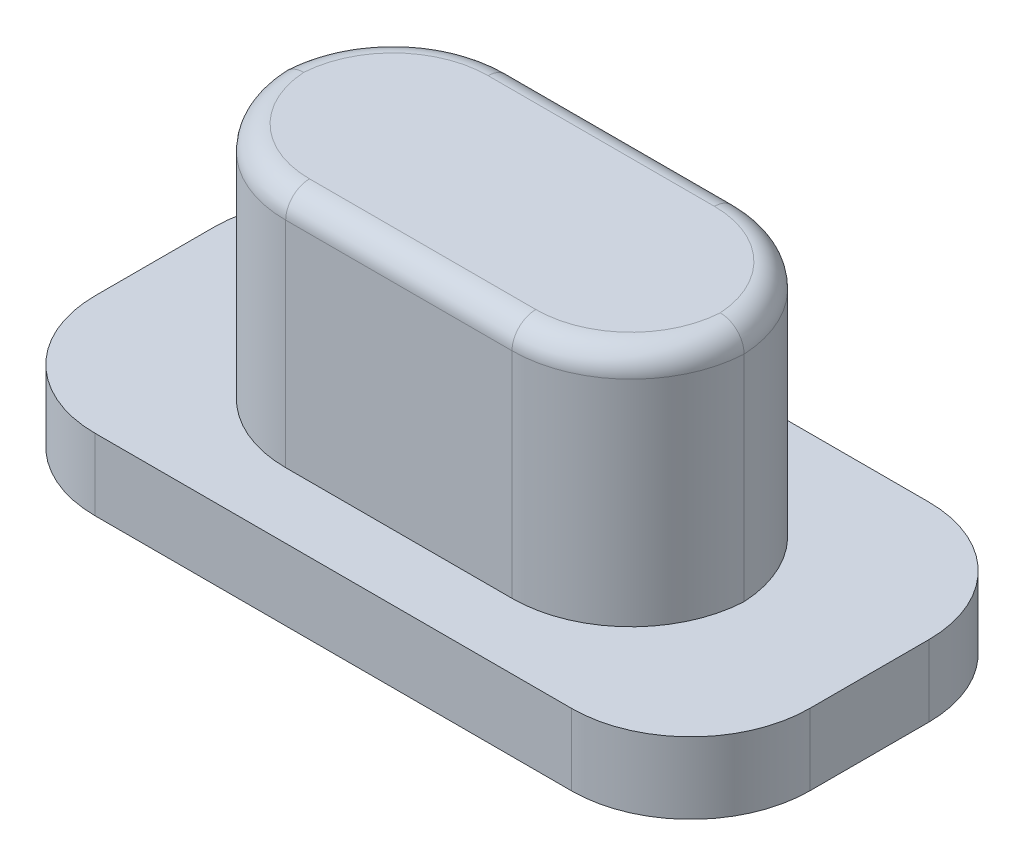
ISO-10303-21;
HEADER;
FILE_DESCRIPTION(('STEP AP214'),'2;1');
FILE_NAME('part.step','',(''),(''),'','','');
FILE_SCHEMA(('AUTOMOTIVE_DESIGN { 1 0 10303 214 1 1 1 1 }'));
ENDSEC;
DATA;
#1=APPLICATION_CONTEXT('core data for automotive mechanical design processes');
#2=APPLICATION_PROTOCOL_DEFINITION('international standard','automotive_design',2000,#1);
#3=PRODUCT_CONTEXT('',#1,'mechanical');
#4=PRODUCT('Part','Part','',(#3));
#5=PRODUCT_RELATED_PRODUCT_CATEGORY('part','',(#4));
#6=PRODUCT_DEFINITION_FORMATION('','',#4);
#7=PRODUCT_DEFINITION_CONTEXT('part definition',#1,'design');
#8=PRODUCT_DEFINITION('design','',#6,#7);
#9=PRODUCT_DEFINITION_SHAPE('','',#8);
#10=(LENGTH_UNIT() NAMED_UNIT(*) SI_UNIT(.MILLI.,.METRE.));
#11=(NAMED_UNIT(*) PLANE_ANGLE_UNIT() SI_UNIT($,.RADIAN.));
#12=(NAMED_UNIT(*) SI_UNIT($,.STERADIAN.) SOLID_ANGLE_UNIT());
#13=UNCERTAINTY_MEASURE_WITH_UNIT(LENGTH_MEASURE(1.E-05),#10,'distance_accuracy_value','');
#14=(GEOMETRIC_REPRESENTATION_CONTEXT(3) GLOBAL_UNCERTAINTY_ASSIGNED_CONTEXT((#13)) GLOBAL_UNIT_ASSIGNED_CONTEXT((#10,
#11,#12)) REPRESENTATION_CONTEXT('',''));
#15=CARTESIAN_POINT('',(0.,0.,0.));
#16=DIRECTION('',(0.,0.,1.));
#17=DIRECTION('',(1.,0.,0.));
#18=AXIS2_PLACEMENT_3D('',#15,#16,#17);
#19=CARTESIAN_POINT('',(0.,0.,0.));
#20=DIRECTION('',(0.,1.,0.));
#21=DIRECTION('',(0.,0.,1.));
#22=AXIS2_PLACEMENT_3D('',#19,#20,#21);
#23=PLANE('',#22);
#24=DIRECTION('',(-1.,0.,0.));
#25=VECTOR('',#24,1.);
#26=CARTESIAN_POINT('',(-2.50310695575245,0.,-1.76035479309902));
#27=LINE('',#26,#25);
#28=CARTESIAN_POINT('',(2.49689304424755,0.,-1.76035479309902));
#29=VERTEX_POINT('',#28);
#30=CARTESIAN_POINT('',(-1.50310695575245,0.,-1.76035479309902));
#31=VERTEX_POINT('',#30);
#32=EDGE_CURVE('E225',#29,#31,#27,.T.);
#33=ORIENTED_EDGE('',*,*,#32,.F.);
#34=CARTESIAN_POINT('',(2.49689304424755,0.,-0.760354793099017));
#35=DIRECTION('',(0.,1.,0.));
#36=DIRECTION('',(0.,0.,1.));
#37=AXIS2_PLACEMENT_3D('',#34,#35,#36);
#38=CIRCLE('',#37,1.);
#39=CARTESIAN_POINT('',(3.49689304424755,0.,-0.760354793099017));
#40=VERTEX_POINT('',#39);
#41=EDGE_CURVE('E255',#29,#40,#38,.F.);
#42=ORIENTED_EDGE('',*,*,#41,.T.);
#43=DIRECTION('',(0.,0.,-1.));
#44=VECTOR('',#43,1.);
#45=CARTESIAN_POINT('',(3.49689304424755,0.,-1.76035479309902));
#46=LINE('',#45,#44);
#47=CARTESIAN_POINT('',(3.49689304424755,0.,0.239645206900983));
#48=VERTEX_POINT('',#47);
#49=EDGE_CURVE('E240',#48,#40,#46,.T.);
#50=ORIENTED_EDGE('',*,*,#49,.F.);
#51=CARTESIAN_POINT('',(2.49689304424755,0.,0.239645206900984));
#52=DIRECTION('',(0.,1.,0.));
#53=DIRECTION('',(0.,0.,1.));
#54=AXIS2_PLACEMENT_3D('',#51,#52,#53);
#55=CIRCLE('',#54,1.);
#56=CARTESIAN_POINT('',(2.49689304424755,0.,1.23964520690098));
#57=VERTEX_POINT('',#56);
#58=EDGE_CURVE('E253',#48,#57,#55,.F.);
#59=ORIENTED_EDGE('',*,*,#58,.T.);
#60=DIRECTION('',(1.,0.,0.));
#61=VECTOR('',#60,1.);
#62=CARTESIAN_POINT('',(-2.50310695575245,0.,1.23964520690098));
#63=LINE('',#62,#61);
#64=CARTESIAN_POINT('',(-1.50310695575245,0.,1.23964520690098));
#65=VERTEX_POINT('',#64);
#66=EDGE_CURVE('E237',#65,#57,#63,.T.);
#67=ORIENTED_EDGE('',*,*,#66,.F.);
#68=CARTESIAN_POINT('',(-1.50310695575245,0.,0.239645206900983));
#69=DIRECTION('',(0.,1.,0.));
#70=DIRECTION('',(0.,0.,1.));
#71=AXIS2_PLACEMENT_3D('',#68,#69,#70);
#72=CIRCLE('',#71,1.);
#73=CARTESIAN_POINT('',(-2.50310695575245,0.,0.239645206900983));
#74=VERTEX_POINT('',#73);
#75=EDGE_CURVE('E249',#65,#74,#72,.F.);
#76=ORIENTED_EDGE('',*,*,#75,.T.);
#77=DIRECTION('',(0.,0.,1.));
#78=VECTOR('',#77,1.);
#79=CARTESIAN_POINT('',(-2.50310695575245,0.,-1.76035479309902));
#80=LINE('',#79,#78);
#81=CARTESIAN_POINT('',(-2.50310695575245,0.,-0.760354793099017));
#82=VERTEX_POINT('',#81);
#83=EDGE_CURVE('E220',#82,#74,#80,.T.);
#84=ORIENTED_EDGE('',*,*,#83,.F.);
#85=CARTESIAN_POINT('',(-1.50310695575245,0.,-0.760354793099017));
#86=DIRECTION('',(0.,1.,0.));
#87=DIRECTION('',(0.,0.,1.));
#88=AXIS2_PLACEMENT_3D('',#85,#86,#87);
#89=CIRCLE('',#88,1.);
#90=EDGE_CURVE('E251',#82,#31,#89,.F.);
#91=ORIENTED_EDGE('',*,*,#90,.T.);
#92=EDGE_LOOP('',(#33,#42,#50,#59,#67,#76,#84,#91));
#93=FACE_BOUND('',#92,.T.);
#94=DIRECTION('',(0.,0.,-1.));
#95=VECTOR('',#94,1.);
#96=CARTESIAN_POINT('',(-1.00310695575245,0.,-1.06035479309902));
#97=LINE('',#96,#95);
#98=CARTESIAN_POINT('',(-1.00310695575245,0.,0.539645206900984));
#99=VERTEX_POINT('',#98);
#100=CARTESIAN_POINT('',(-1.00310695575245,0.,-1.06035479309902));
#101=VERTEX_POINT('',#100);
#102=EDGE_CURVE('E205',#99,#101,#97,.T.);
#103=ORIENTED_EDGE('',*,*,#102,.F.);
#104=DIRECTION('',(-1.,0.,0.));
#105=VECTOR('',#104,1.);
#106=CARTESIAN_POINT('',(1.99689304424755,0.,0.539645206900984));
#107=LINE('',#106,#105);
#108=CARTESIAN_POINT('',(1.99689304424755,0.,0.539645206900984));
#109=VERTEX_POINT('',#108);
#110=EDGE_CURVE('E202',#109,#99,#107,.T.);
#111=ORIENTED_EDGE('',*,*,#110,.F.);
#112=DIRECTION('',(0.,0.,1.));
#113=VECTOR('',#112,1.);
#114=CARTESIAN_POINT('',(1.99689304424755,0.,-1.06035479309902));
#115=LINE('',#114,#113);
#116=CARTESIAN_POINT('',(1.99689304424755,0.,-1.06035479309902));
#117=VERTEX_POINT('',#116);
#118=EDGE_CURVE('E654',#117,#109,#115,.T.);
#119=ORIENTED_EDGE('',*,*,#118,.F.);
#120=DIRECTION('',(1.,0.,0.));
#121=VECTOR('',#120,1.);
#122=CARTESIAN_POINT('',(1.99689304424755,0.,-1.06035479309902));
#123=LINE('',#122,#121);
#124=EDGE_CURVE('E660',#101,#117,#123,.T.);
#125=ORIENTED_EDGE('',*,*,#124,.F.);
#126=EDGE_LOOP('',(#103,#111,#119,#125));
#127=FACE_BOUND('',#126,.T.);
#128=ADVANCED_FACE('F35',(#93,#127),#23,.F.);
#129=CARTESIAN_POINT('',(-2.50310695575245,0.6,-1.76035479309902));
#130=DIRECTION('',(1.,0.,0.));
#131=DIRECTION('',(0.,0.,-1.));
#132=AXIS2_PLACEMENT_3D('',#129,#130,#131);
#133=PLANE('',#132);
#134=DIRECTION('',(0.,0.,1.));
#135=VECTOR('',#134,1.);
#136=CARTESIAN_POINT('',(-2.50310695575245,0.6,-1.76035479309902));
#137=LINE('',#136,#135);
#138=CARTESIAN_POINT('',(-2.50310695575245,0.6,-0.760354793099017));
#139=VERTEX_POINT('',#138);
#140=CARTESIAN_POINT('',(-2.50310695575245,0.6,0.239645206900983));
#141=VERTEX_POINT('',#140);
#142=EDGE_CURVE('E221',#139,#141,#137,.T.);
#143=ORIENTED_EDGE('',*,*,#142,.F.);
#144=DIRECTION('',(0.,-1.,0.));
#145=VECTOR('',#144,1.);
#146=CARTESIAN_POINT('',(-2.50310695575245,0.6,-0.760354793099017));
#147=LINE('',#146,#145);
#148=EDGE_CURVE('E277',#139,#82,#147,.T.);
#149=ORIENTED_EDGE('',*,*,#148,.T.);
#150=ORIENTED_EDGE('',*,*,#83,.T.);
#151=DIRECTION('',(0.,-1.,0.));
#152=VECTOR('',#151,1.);
#153=CARTESIAN_POINT('',(-2.50310695575245,0.6,0.239645206900983));
#154=LINE('',#153,#152);
#155=EDGE_CURVE('E275',#74,#141,#154,.F.);
#156=ORIENTED_EDGE('',*,*,#155,.T.);
#157=EDGE_LOOP('',(#143,#149,#150,#156));
#158=FACE_BOUND('',#157,.T.);
#159=ADVANCED_FACE('F414',(#158),#133,.F.);
#160=CARTESIAN_POINT('',(-2.50310695575245,0.6,1.23964520690098));
#161=DIRECTION('',(0.,0.,-1.));
#162=DIRECTION('',(-1.,0.,0.));
#163=AXIS2_PLACEMENT_3D('',#160,#161,#162);
#164=PLANE('',#163);
#165=ORIENTED_EDGE('',*,*,#66,.T.);
#166=DIRECTION('',(0.,-1.,0.));
#167=VECTOR('',#166,1.);
#168=CARTESIAN_POINT('',(2.49689304424755,0.6,1.23964520690098));
#169=LINE('',#168,#167);
#170=CARTESIAN_POINT('',(2.49689304424755,0.6,1.23964520690098));
#171=VERTEX_POINT('',#170);
#172=EDGE_CURVE('E273',#57,#171,#169,.F.);
#173=ORIENTED_EDGE('',*,*,#172,.T.);
#174=DIRECTION('',(1.,0.,0.));
#175=VECTOR('',#174,1.);
#176=CARTESIAN_POINT('',(-2.50310695575245,0.6,1.23964520690098));
#177=LINE('',#176,#175);
#178=CARTESIAN_POINT('',(-1.50310695575245,0.6,1.23964520690098));
#179=VERTEX_POINT('',#178);
#180=EDGE_CURVE('E224',#179,#171,#177,.T.);
#181=ORIENTED_EDGE('',*,*,#180,.F.);
#182=DIRECTION('',(0.,-1.,0.));
#183=VECTOR('',#182,1.);
#184=CARTESIAN_POINT('',(-1.50310695575245,0.6,1.23964520690098));
#185=LINE('',#184,#183);
#186=EDGE_CURVE('E270',#179,#65,#185,.T.);
#187=ORIENTED_EDGE('',*,*,#186,.T.);
#188=EDGE_LOOP('',(#165,#173,#181,#187));
#189=FACE_BOUND('',#188,.T.);
#190=ADVANCED_FACE('F420',(#189),#164,.F.);
#191=CARTESIAN_POINT('',(3.49689304424755,0.6,-1.76035479309902));
#192=DIRECTION('',(-1.,0.,0.));
#193=DIRECTION('',(0.,0.,1.));
#194=AXIS2_PLACEMENT_3D('',#191,#192,#193);
#195=PLANE('',#194);
#196=ORIENTED_EDGE('',*,*,#49,.T.);
#197=DIRECTION('',(0.,-1.,0.));
#198=VECTOR('',#197,1.);
#199=CARTESIAN_POINT('',(3.49689304424755,0.6,-0.760354793099017));
#200=LINE('',#199,#198);
#201=CARTESIAN_POINT('',(3.49689304424755,0.6,-0.760354793099017));
#202=VERTEX_POINT('',#201);
#203=EDGE_CURVE('E260',#40,#202,#200,.F.);
#204=ORIENTED_EDGE('',*,*,#203,.T.);
#205=DIRECTION('',(0.,0.,-1.));
#206=VECTOR('',#205,1.);
#207=CARTESIAN_POINT('',(3.49689304424755,0.6,-1.76035479309902));
#208=LINE('',#207,#206);
#209=CARTESIAN_POINT('',(3.49689304424755,0.6,0.239645206900983));
#210=VERTEX_POINT('',#209);
#211=EDGE_CURVE('E228',#210,#202,#208,.T.);
#212=ORIENTED_EDGE('',*,*,#211,.F.);
#213=DIRECTION('',(0.,-1.,0.));
#214=VECTOR('',#213,1.);
#215=CARTESIAN_POINT('',(3.49689304424755,0.6,0.239645206900983));
#216=LINE('',#215,#214);
#217=EDGE_CURVE('E257',#210,#48,#216,.T.);
#218=ORIENTED_EDGE('',*,*,#217,.T.);
#219=EDGE_LOOP('',(#196,#204,#212,#218));
#220=FACE_BOUND('',#219,.T.);
#221=ADVANCED_FACE('F431',(#220),#195,.F.);
#222=CARTESIAN_POINT('',(-2.50310695575245,0.6,-1.76035479309902));
#223=DIRECTION('',(0.,0.,1.));
#224=DIRECTION('',(1.,0.,0.));
#225=AXIS2_PLACEMENT_3D('',#222,#223,#224);
#226=PLANE('',#225);
#227=DIRECTION('',(-1.,0.,0.));
#228=VECTOR('',#227,1.);
#229=CARTESIAN_POINT('',(-2.50310695575245,0.6,-1.76035479309902));
#230=LINE('',#229,#228);
#231=CARTESIAN_POINT('',(2.49689304424755,0.6,-1.76035479309902));
#232=VERTEX_POINT('',#231);
#233=CARTESIAN_POINT('',(-1.50310695575245,0.6,-1.76035479309902));
#234=VERTEX_POINT('',#233);
#235=EDGE_CURVE('E231',#232,#234,#230,.T.);
#236=ORIENTED_EDGE('',*,*,#235,.F.);
#237=DIRECTION('',(0.,-1.,0.));
#238=VECTOR('',#237,1.);
#239=CARTESIAN_POINT('',(2.49689304424755,0.6,-1.76035479309902));
#240=LINE('',#239,#238);
#241=EDGE_CURVE('E246',#232,#29,#240,.T.);
#242=ORIENTED_EDGE('',*,*,#241,.T.);
#243=ORIENTED_EDGE('',*,*,#32,.T.);
#244=DIRECTION('',(0.,-1.,0.));
#245=VECTOR('',#244,1.);
#246=CARTESIAN_POINT('',(-1.50310695575245,0.6,-1.76035479309902));
#247=LINE('',#246,#245);
#248=EDGE_CURVE('E234',#31,#234,#247,.F.);
#249=ORIENTED_EDGE('',*,*,#248,.T.);
#250=EDGE_LOOP('',(#236,#242,#243,#249));
#251=FACE_BOUND('',#250,.T.);
#252=ADVANCED_FACE('F428',(#251),#226,.F.);
#253=CARTESIAN_POINT('',(0.,0.6,0.));
#254=DIRECTION('',(0.,1.,0.));
#255=DIRECTION('',(0.,0.,1.));
#256=AXIS2_PLACEMENT_3D('',#253,#254,#255);
#257=PLANE('',#256);
#258=CARTESIAN_POINT('',(1.44689304424755,0.6,-0.210354793099017));
#259=DIRECTION('',(0.,1.,0.));
#260=DIRECTION('',(0.,0.,1.));
#261=AXIS2_PLACEMENT_3D('',#258,#259,#260);
#262=CIRCLE('',#261,1.);
#263=CARTESIAN_POINT('',(1.44689304424755,0.6,-1.21035479309902));
#264=VERTEX_POINT('',#263);
#265=CARTESIAN_POINT('',(2.44564226201946,0.6,-0.260354793099021));
#266=VERTEX_POINT('',#265);
#267=EDGE_CURVE('E289',#264,#266,#262,.F.);
#268=ORIENTED_EDGE('',*,*,#267,.T.);
#269=CARTESIAN_POINT('',(1.44689304424755,0.6,-0.310354793099017));
#270=DIRECTION('',(0.,1.,0.));
#271=DIRECTION('',(0.,0.,1.));
#272=AXIS2_PLACEMENT_3D('',#269,#270,#271);
#273=CIRCLE('',#272,1.);
#274=CARTESIAN_POINT('',(1.44689304424755,0.6,0.689645206900983));
#275=VERTEX_POINT('',#274);
#276=EDGE_CURVE('E296',#266,#275,#273,.F.);
#277=ORIENTED_EDGE('',*,*,#276,.T.);
#278=DIRECTION('',(1.,0.,0.));
#279=VECTOR('',#278,1.);
#280=CARTESIAN_POINT('',(-1.45310695575245,0.6,0.689645206900983));
#281=LINE('',#280,#279);
#282=CARTESIAN_POINT('',(-0.453106955752447,0.6,0.689645206900983));
#283=VERTEX_POINT('',#282);
#284=EDGE_CURVE('E217',#283,#275,#281,.T.);
#285=ORIENTED_EDGE('',*,*,#284,.F.);
#286=CARTESIAN_POINT('',(-0.453106955752447,0.6,-0.310354793099017));
#287=DIRECTION('',(0.,1.,0.));
#288=DIRECTION('',(0.,0.,1.));
#289=AXIS2_PLACEMENT_3D('',#286,#287,#288);
#290=CIRCLE('',#289,1.);
#291=CARTESIAN_POINT('',(-1.45185617352436,0.6,-0.260354793099016));
#292=VERTEX_POINT('',#291);
#293=EDGE_CURVE('E294',#283,#292,#290,.F.);
#294=ORIENTED_EDGE('',*,*,#293,.T.);
#295=CARTESIAN_POINT('',(-0.453106955752447,0.6,-0.210354793099017));
#296=DIRECTION('',(0.,1.,0.));
#297=DIRECTION('',(0.,0.,1.));
#298=AXIS2_PLACEMENT_3D('',#295,#296,#297);
#299=CIRCLE('',#298,1.);
#300=CARTESIAN_POINT('',(-0.453106955752447,0.6,-1.21035479309902));
#301=VERTEX_POINT('',#300);
#302=EDGE_CURVE('E292',#292,#301,#299,.F.);
#303=ORIENTED_EDGE('',*,*,#302,.T.);
#304=DIRECTION('',(-1.,0.,0.));
#305=VECTOR('',#304,1.);
#306=CARTESIAN_POINT('',(-1.45310695575245,0.6,-1.21035479309902));
#307=LINE('',#306,#305);
#308=EDGE_CURVE('E214',#264,#301,#307,.T.);
#309=ORIENTED_EDGE('',*,*,#308,.F.);
#310=EDGE_LOOP('',(#268,#277,#285,#294,#303,#309));
#311=FACE_BOUND('',#310,.T.);
#312=ORIENTED_EDGE('',*,*,#211,.T.);
#313=CARTESIAN_POINT('',(2.49689304424755,0.6,-0.760354793099017));
#314=DIRECTION('',(0.,1.,0.));
#315=DIRECTION('',(0.,0.,1.));
#316=AXIS2_PLACEMENT_3D('',#313,#314,#315);
#317=CIRCLE('',#316,1.);
#318=EDGE_CURVE('E268',#202,#232,#317,.T.);
#319=ORIENTED_EDGE('',*,*,#318,.T.);
#320=ORIENTED_EDGE('',*,*,#235,.T.);
#321=CARTESIAN_POINT('',(-1.50310695575245,0.6,-0.760354793099017));
#322=DIRECTION('',(0.,1.,0.));
#323=DIRECTION('',(0.,0.,1.));
#324=AXIS2_PLACEMENT_3D('',#321,#322,#323);
#325=CIRCLE('',#324,1.);
#326=EDGE_CURVE('E264',#234,#139,#325,.T.);
#327=ORIENTED_EDGE('',*,*,#326,.T.);
#328=ORIENTED_EDGE('',*,*,#142,.T.);
#329=CARTESIAN_POINT('',(-1.50310695575245,0.6,0.239645206900983));
#330=DIRECTION('',(0.,1.,0.));
#331=DIRECTION('',(0.,0.,1.));
#332=AXIS2_PLACEMENT_3D('',#329,#330,#331);
#333=CIRCLE('',#332,1.);
#334=EDGE_CURVE('E262',#141,#179,#333,.T.);
#335=ORIENTED_EDGE('',*,*,#334,.T.);
#336=ORIENTED_EDGE('',*,*,#180,.T.);
#337=CARTESIAN_POINT('',(2.49689304424755,0.6,0.239645206900984));
#338=DIRECTION('',(0.,1.,0.));
#339=DIRECTION('',(0.,0.,1.));
#340=AXIS2_PLACEMENT_3D('',#337,#338,#339);
#341=CIRCLE('',#340,1.);
#342=EDGE_CURVE('E266',#171,#210,#341,.T.);
#343=ORIENTED_EDGE('',*,*,#342,.T.);
#344=EDGE_LOOP('',(#312,#319,#320,#327,#328,#335,#336,#343));
#345=FACE_BOUND('',#344,.T.);
#346=ADVANCED_FACE('F393',(#311,#345),#257,.T.);
#347=CARTESIAN_POINT('',(-1.45310695575245,2.6,-1.21035479309902));
#348=DIRECTION('',(0.,0.,1.));
#349=DIRECTION('',(1.,0.,0.));
#350=AXIS2_PLACEMENT_3D('',#347,#348,#349);
#351=PLANE('',#350);
#352=DIRECTION('',(0.,-1.,0.));
#353=VECTOR('',#352,1.);
#354=CARTESIAN_POINT('',(-0.453106955752447,2.6,-1.21035479309902));
#355=LINE('',#354,#353);
#356=CARTESIAN_POINT('',(-0.453106955752447,2.4,-1.21035479309902));
#357=VERTEX_POINT('',#356);
#358=EDGE_CURVE('E280',#301,#357,#355,.F.);
#359=ORIENTED_EDGE('',*,*,#358,.T.);
#360=DIRECTION('',(-1.,0.,0.));
#361=VECTOR('',#360,1.);
#362=CARTESIAN_POINT('',(1.44689304424755,2.4,-1.21035479309902));
#363=LINE('',#362,#361);
#364=CARTESIAN_POINT('',(1.44689304424755,2.4,-1.21035479309902));
#365=VERTEX_POINT('',#364);
#366=EDGE_CURVE('E11',#357,#365,#363,.F.);
#367=ORIENTED_EDGE('',*,*,#366,.T.);
#368=DIRECTION('',(0.,-1.,0.));
#369=VECTOR('',#368,1.);
#370=CARTESIAN_POINT('',(1.44689304424755,2.6,-1.21035479309902));
#371=LINE('',#370,#369);
#372=EDGE_CURVE('E282',#365,#264,#371,.T.);
#373=ORIENTED_EDGE('',*,*,#372,.T.);
#374=ORIENTED_EDGE('',*,*,#308,.T.);
#375=EDGE_LOOP('',(#359,#367,#373,#374));
#376=FACE_BOUND('',#375,.T.);
#377=ADVANCED_FACE('F402',(#376),#351,.F.);
#378=CARTESIAN_POINT('',(-1.45310695575245,2.6,0.689645206900983));
#379=DIRECTION('',(0.,0.,-1.));
#380=DIRECTION('',(-1.,0.,0.));
#381=AXIS2_PLACEMENT_3D('',#378,#379,#380);
#382=PLANE('',#381);
#383=DIRECTION('',(0.,-1.,0.));
#384=VECTOR('',#383,1.);
#385=CARTESIAN_POINT('',(1.44689304424755,2.6,0.689645206900983));
#386=LINE('',#385,#384);
#387=CARTESIAN_POINT('',(1.44689304424755,2.4,0.689645206900983));
#388=VERTEX_POINT('',#387);
#389=EDGE_CURVE('E284',#275,#388,#386,.F.);
#390=ORIENTED_EDGE('',*,*,#389,.T.);
#391=DIRECTION('',(1.,0.,0.));
#392=VECTOR('',#391,1.);
#393=CARTESIAN_POINT('',(-0.453106955752447,2.4,0.689645206900983));
#394=LINE('',#393,#392);
#395=CARTESIAN_POINT('',(-0.453106955752447,2.4,0.689645206900983));
#396=VERTEX_POINT('',#395);
#397=EDGE_CURVE('E317',#388,#396,#394,.F.);
#398=ORIENTED_EDGE('',*,*,#397,.T.);
#399=DIRECTION('',(0.,-1.,0.));
#400=VECTOR('',#399,1.);
#401=CARTESIAN_POINT('',(-0.453106955752447,2.6,0.689645206900983));
#402=LINE('',#401,#400);
#403=EDGE_CURVE('E287',#396,#283,#402,.T.);
#404=ORIENTED_EDGE('',*,*,#403,.T.);
#405=ORIENTED_EDGE('',*,*,#284,.T.);
#406=EDGE_LOOP('',(#390,#398,#404,#405));
#407=FACE_BOUND('',#406,.T.);
#408=ADVANCED_FACE('F398',(#407),#382,.F.);
#409=CARTESIAN_POINT('',(0.,2.6,0.));
#410=DIRECTION('',(0.,1.,0.));
#411=DIRECTION('',(0.,0.,1.));
#412=AXIS2_PLACEMENT_3D('',#409,#410,#411);
#413=PLANE('',#412);
#414=CARTESIAN_POINT('',(1.44689304424755,2.6,-0.310354793099017));
#415=DIRECTION('',(0.,1.,0.));
#416=DIRECTION('',(0.,0.,1.));
#417=AXIS2_PLACEMENT_3D('',#414,#415,#416);
#418=CIRCLE('',#417,0.8);
#419=CARTESIAN_POINT('',(1.44689304424755,2.6,0.489645206900983));
#420=VERTEX_POINT('',#419);
#421=CARTESIAN_POINT('',(2.24532901538112,2.6,-0.26035479309902));
#422=VERTEX_POINT('',#421);
#423=EDGE_CURVE('E307',#420,#422,#418,.T.);
#424=ORIENTED_EDGE('',*,*,#423,.T.);
#425=CARTESIAN_POINT('',(1.44689304424755,2.6,-0.210354793099017));
#426=DIRECTION('',(0.,1.,0.));
#427=DIRECTION('',(0.,0.,1.));
#428=AXIS2_PLACEMENT_3D('',#425,#426,#427);
#429=CIRCLE('',#428,0.8);
#430=CARTESIAN_POINT('',(1.44689304424755,2.6,-1.01035479309902));
#431=VERTEX_POINT('',#430);
#432=EDGE_CURVE('E309',#422,#431,#429,.T.);
#433=ORIENTED_EDGE('',*,*,#432,.T.);
#434=DIRECTION('',(-1.,0.,0.));
#435=VECTOR('',#434,1.);
#436=CARTESIAN_POINT('',(-0.453106955752447,2.6,-1.01035479309902));
#437=LINE('',#436,#435);
#438=CARTESIAN_POINT('',(-0.453106955752447,2.6,-1.01035479309902));
#439=VERTEX_POINT('',#438);
#440=EDGE_CURVE('E298',#431,#439,#437,.T.);
#441=ORIENTED_EDGE('',*,*,#440,.T.);
#442=CARTESIAN_POINT('',(-0.453106955752447,2.6,-0.210354793099017));
#443=DIRECTION('',(0.,1.,0.));
#444=DIRECTION('',(0.,0.,1.));
#445=AXIS2_PLACEMENT_3D('',#442,#443,#444);
#446=CIRCLE('',#445,0.8);
#447=CARTESIAN_POINT('',(-1.25154292688601,2.6,-0.260354793099016));
#448=VERTEX_POINT('',#447);
#449=EDGE_CURVE('E301',#439,#448,#446,.T.);
#450=ORIENTED_EDGE('',*,*,#449,.T.);
#451=CARTESIAN_POINT('',(-0.453106955752447,2.6,-0.310354793099017));
#452=DIRECTION('',(0.,1.,0.));
#453=DIRECTION('',(0.,0.,1.));
#454=AXIS2_PLACEMENT_3D('',#451,#452,#453);
#455=CIRCLE('',#454,0.8);
#456=CARTESIAN_POINT('',(-0.453106955752447,2.6,0.489645206900983));
#457=VERTEX_POINT('',#456);
#458=EDGE_CURVE('E303',#448,#457,#455,.T.);
#459=ORIENTED_EDGE('',*,*,#458,.T.);
#460=DIRECTION('',(1.,0.,0.));
#461=VECTOR('',#460,1.);
#462=CARTESIAN_POINT('',(1.44689304424755,2.6,0.489645206900983));
#463=LINE('',#462,#461);
#464=EDGE_CURVE('E305',#457,#420,#463,.T.);
#465=ORIENTED_EDGE('',*,*,#464,.T.);
#466=EDGE_LOOP('',(#424,#433,#441,#450,#459,#465));
#467=FACE_BOUND('',#466,.T.);
#468=ADVANCED_FACE('F372',(#467),#413,.T.);
#469=CARTESIAN_POINT('',(2.49689304424755,0.6,-0.760354793099017));
#470=DIRECTION('',(0.,-1.,0.));
#471=DIRECTION('',(0.,0.,-1.));
#472=AXIS2_PLACEMENT_3D('',#469,#470,#471);
#473=CYLINDRICAL_SURFACE('',#472,1.);
#474=ORIENTED_EDGE('',*,*,#318,.F.);
#475=ORIENTED_EDGE('',*,*,#203,.F.);
#476=ORIENTED_EDGE('',*,*,#41,.F.);
#477=ORIENTED_EDGE('',*,*,#241,.F.);
#478=EDGE_LOOP('',(#474,#475,#476,#477));
#479=FACE_BOUND('',#478,.T.);
#480=ADVANCED_FACE('F439',(#479),#473,.T.);
#481=CARTESIAN_POINT('',(2.49689304424755,0.6,0.239645206900984));
#482=DIRECTION('',(0.,-1.,0.));
#483=DIRECTION('',(0.,0.,-1.));
#484=AXIS2_PLACEMENT_3D('',#481,#482,#483);
#485=CYLINDRICAL_SURFACE('',#484,1.);
#486=ORIENTED_EDGE('',*,*,#342,.F.);
#487=ORIENTED_EDGE('',*,*,#172,.F.);
#488=ORIENTED_EDGE('',*,*,#58,.F.);
#489=ORIENTED_EDGE('',*,*,#217,.F.);
#490=EDGE_LOOP('',(#486,#487,#488,#489));
#491=FACE_BOUND('',#490,.T.);
#492=ADVANCED_FACE('F442',(#491),#485,.T.);
#493=CARTESIAN_POINT('',(-1.50310695575245,0.6,-0.760354793099017));
#494=DIRECTION('',(0.,-1.,0.));
#495=DIRECTION('',(0.,0.,-1.));
#496=AXIS2_PLACEMENT_3D('',#493,#494,#495);
#497=CYLINDRICAL_SURFACE('',#496,1.);
#498=ORIENTED_EDGE('',*,*,#326,.F.);
#499=ORIENTED_EDGE('',*,*,#248,.F.);
#500=ORIENTED_EDGE('',*,*,#90,.F.);
#501=ORIENTED_EDGE('',*,*,#148,.F.);
#502=EDGE_LOOP('',(#498,#499,#500,#501));
#503=FACE_BOUND('',#502,.T.);
#504=ADVANCED_FACE('F446',(#503),#497,.T.);
#505=CARTESIAN_POINT('',(-1.50310695575245,0.6,0.239645206900983));
#506=DIRECTION('',(0.,-1.,0.));
#507=DIRECTION('',(0.,0.,-1.));
#508=AXIS2_PLACEMENT_3D('',#505,#506,#507);
#509=CYLINDRICAL_SURFACE('',#508,1.);
#510=ORIENTED_EDGE('',*,*,#334,.F.);
#511=ORIENTED_EDGE('',*,*,#155,.F.);
#512=ORIENTED_EDGE('',*,*,#75,.F.);
#513=ORIENTED_EDGE('',*,*,#186,.F.);
#514=EDGE_LOOP('',(#510,#511,#512,#513));
#515=FACE_BOUND('',#514,.T.);
#516=ADVANCED_FACE('F450',(#515),#509,.T.);
#517=CARTESIAN_POINT('',(1.44689304424755,2.6,-0.310354793099017));
#518=DIRECTION('',(0.,-1.,0.));
#519=DIRECTION('',(0.,0.,-1.));
#520=AXIS2_PLACEMENT_3D('',#517,#518,#519);
#521=CYLINDRICAL_SURFACE('',#520,1.);
#522=DIRECTION('',(0.,-1.,0.));
#523=VECTOR('',#522,1.);
#524=CARTESIAN_POINT('',(2.44564226201946,1.6,-0.260354793099021));
#525=LINE('',#524,#523);
#526=CARTESIAN_POINT('',(2.44564226201946,2.4,-0.260354793099021));
#527=VERTEX_POINT('',#526);
#528=EDGE_CURVE('E208',#527,#266,#525,.T.);
#529=ORIENTED_EDGE('',*,*,#528,.F.);
#530=CARTESIAN_POINT('',(1.44689304424755,2.4,-0.310354793099017));
#531=DIRECTION('',(0.,1.,0.));
#532=DIRECTION('',(0.,0.,1.));
#533=AXIS2_PLACEMENT_3D('',#530,#531,#532);
#534=CIRCLE('',#533,1.);
#535=EDGE_CURVE('E315',#527,#388,#534,.F.);
#536=ORIENTED_EDGE('',*,*,#535,.T.);
#537=ORIENTED_EDGE('',*,*,#389,.F.);
#538=ORIENTED_EDGE('',*,*,#276,.F.);
#539=EDGE_LOOP('',(#529,#536,#537,#538));
#540=FACE_BOUND('',#539,.T.);
#541=ADVANCED_FACE('F389',(#540),#521,.T.);
#542=CARTESIAN_POINT('',(1.44689304424755,2.6,-0.210354793099017));
#543=DIRECTION('',(0.,-1.,0.));
#544=DIRECTION('',(0.,0.,-1.));
#545=AXIS2_PLACEMENT_3D('',#542,#543,#544);
#546=CYLINDRICAL_SURFACE('',#545,1.);
#547=ORIENTED_EDGE('',*,*,#372,.F.);
#548=CARTESIAN_POINT('',(1.44689304424755,2.4,-0.210354793099017));
#549=DIRECTION('',(0.,1.,0.));
#550=DIRECTION('',(0.,0.,1.));
#551=AXIS2_PLACEMENT_3D('',#548,#549,#550);
#552=CIRCLE('',#551,1.);
#553=EDGE_CURVE('E312',#365,#527,#552,.F.);
#554=ORIENTED_EDGE('',*,*,#553,.T.);
#555=ORIENTED_EDGE('',*,*,#528,.T.);
#556=ORIENTED_EDGE('',*,*,#267,.F.);
#557=EDGE_LOOP('',(#547,#554,#555,#556));
#558=FACE_BOUND('',#557,.T.);
#559=ADVANCED_FACE('F385',(#558),#546,.T.);
#560=CARTESIAN_POINT('',(-0.453106955752447,2.6,-0.310354793099017));
#561=DIRECTION('',(0.,-1.,0.));
#562=DIRECTION('',(0.,0.,-1.));
#563=AXIS2_PLACEMENT_3D('',#560,#561,#562);
#564=CYLINDRICAL_SURFACE('',#563,1.);
#565=ORIENTED_EDGE('',*,*,#403,.F.);
#566=CARTESIAN_POINT('',(-0.453106955752447,2.4,-0.310354793099017));
#567=DIRECTION('',(0.,1.,0.));
#568=DIRECTION('',(0.,0.,1.));
#569=AXIS2_PLACEMENT_3D('',#566,#567,#568);
#570=CIRCLE('',#569,1.);
#571=CARTESIAN_POINT('',(-1.45185617352436,2.4,-0.260354793099016));
#572=VERTEX_POINT('',#571);
#573=EDGE_CURVE('E59',#396,#572,#570,.F.);
#574=ORIENTED_EDGE('',*,*,#573,.T.);
#575=DIRECTION('',(0.,-1.,0.));
#576=VECTOR('',#575,1.);
#577=CARTESIAN_POINT('',(-1.45185617352436,1.6,-0.260354793099016));
#578=LINE('',#577,#576);
#579=EDGE_CURVE('E206',#292,#572,#578,.F.);
#580=ORIENTED_EDGE('',*,*,#579,.F.);
#581=ORIENTED_EDGE('',*,*,#293,.F.);
#582=EDGE_LOOP('',(#565,#574,#580,#581));
#583=FACE_BOUND('',#582,.T.);
#584=ADVANCED_FACE('F399',(#583),#564,.T.);
#585=CARTESIAN_POINT('',(-0.453106955752447,2.6,-0.210354793099017));
#586=DIRECTION('',(0.,-1.,0.));
#587=DIRECTION('',(0.,0.,-1.));
#588=AXIS2_PLACEMENT_3D('',#585,#586,#587);
#589=CYLINDRICAL_SURFACE('',#588,1.);
#590=ORIENTED_EDGE('',*,*,#579,.T.);
#591=CARTESIAN_POINT('',(-0.453106955752447,2.4,-0.210354793099017));
#592=DIRECTION('',(0.,1.,0.));
#593=DIRECTION('',(0.,0.,1.));
#594=AXIS2_PLACEMENT_3D('',#591,#592,#593);
#595=CIRCLE('',#594,1.);
#596=EDGE_CURVE('E44',#572,#357,#595,.F.);
#597=ORIENTED_EDGE('',*,*,#596,.T.);
#598=ORIENTED_EDGE('',*,*,#358,.F.);
#599=ORIENTED_EDGE('',*,*,#302,.F.);
#600=EDGE_LOOP('',(#590,#597,#598,#599));
#601=FACE_BOUND('',#600,.T.);
#602=ADVANCED_FACE('F403',(#601),#589,.T.);
#603=CARTESIAN_POINT('',(-1.00310695575245,-0.2,-1.06035479309902));
#604=DIRECTION('',(1.,0.,0.));
#605=DIRECTION('',(0.,0.,-1.));
#606=AXIS2_PLACEMENT_3D('',#603,#604,#605);
#607=PLANE('',#606);
#608=ORIENTED_EDGE('',*,*,#102,.T.);
#609=DIRECTION('',(0.,1.,0.));
#610=VECTOR('',#609,1.);
#611=CARTESIAN_POINT('',(-1.00310695575245,-0.2,-1.06035479309902));
#612=LINE('',#611,#610);
#613=CARTESIAN_POINT('',(-1.00310695575245,-0.2,-1.06035479309902));
#614=VERTEX_POINT('',#613);
#615=EDGE_CURVE('E186',#614,#101,#612,.T.);
#616=ORIENTED_EDGE('',*,*,#615,.F.);
#617=DIRECTION('',(0.,0.,-1.));
#618=VECTOR('',#617,1.);
#619=CARTESIAN_POINT('',(-1.00310695575245,-0.2,-1.06035479309902));
#620=LINE('',#619,#618);
#621=CARTESIAN_POINT('',(-1.00310695575245,-0.2,0.539645206900984));
#622=VERTEX_POINT('',#621);
#623=EDGE_CURVE('E193',#622,#614,#620,.T.);
#624=ORIENTED_EDGE('',*,*,#623,.F.);
#625=DIRECTION('',(0.,1.,0.));
#626=VECTOR('',#625,1.);
#627=CARTESIAN_POINT('',(-1.00310695575245,-0.2,0.539645206900984));
#628=LINE('',#627,#626);
#629=EDGE_CURVE('E651',#622,#99,#628,.T.);
#630=ORIENTED_EDGE('',*,*,#629,.T.);
#631=EDGE_LOOP('',(#608,#616,#624,#630));
#632=FACE_BOUND('',#631,.T.);
#633=ADVANCED_FACE('F204',(#632),#607,.F.);
#634=CARTESIAN_POINT('',(1.99689304424755,-0.2,-1.06035479309902));
#635=DIRECTION('',(0.,0.,1.));
#636=DIRECTION('',(1.,0.,0.));
#637=AXIS2_PLACEMENT_3D('',#634,#635,#636);
#638=PLANE('',#637);
#639=ORIENTED_EDGE('',*,*,#124,.T.);
#640=DIRECTION('',(0.,1.,0.));
#641=VECTOR('',#640,1.);
#642=CARTESIAN_POINT('',(1.99689304424755,-0.2,-1.06035479309902));
#643=LINE('',#642,#641);
#644=CARTESIAN_POINT('',(1.99689304424755,-0.2,-1.06035479309902));
#645=VERTEX_POINT('',#644);
#646=EDGE_CURVE('E189',#645,#117,#643,.T.);
#647=ORIENTED_EDGE('',*,*,#646,.F.);
#648=DIRECTION('',(1.,0.,0.));
#649=VECTOR('',#648,1.);
#650=CARTESIAN_POINT('',(1.99689304424755,-0.2,-1.06035479309902));
#651=LINE('',#650,#649);
#652=EDGE_CURVE('E181',#614,#645,#651,.T.);
#653=ORIENTED_EDGE('',*,*,#652,.F.);
#654=ORIENTED_EDGE('',*,*,#615,.T.);
#655=EDGE_LOOP('',(#639,#647,#653,#654));
#656=FACE_BOUND('',#655,.T.);
#657=ADVANCED_FACE('F184',(#656),#638,.F.);
#658=CARTESIAN_POINT('',(1.99689304424755,-0.2,-1.06035479309902));
#659=DIRECTION('',(-1.,0.,0.));
#660=DIRECTION('',(0.,0.,1.));
#661=AXIS2_PLACEMENT_3D('',#658,#659,#660);
#662=PLANE('',#661);
#663=ORIENTED_EDGE('',*,*,#118,.T.);
#664=DIRECTION('',(0.,1.,0.));
#665=VECTOR('',#664,1.);
#666=CARTESIAN_POINT('',(1.99689304424755,-0.2,0.539645206900984));
#667=LINE('',#666,#665);
#668=CARTESIAN_POINT('',(1.99689304424755,-0.2,0.539645206900984));
#669=VERTEX_POINT('',#668);
#670=EDGE_CURVE('E210',#669,#109,#667,.T.);
#671=ORIENTED_EDGE('',*,*,#670,.F.);
#672=DIRECTION('',(0.,0.,1.));
#673=VECTOR('',#672,1.);
#674=CARTESIAN_POINT('',(1.99689304424755,-0.2,-1.06035479309902));
#675=LINE('',#674,#673);
#676=EDGE_CURVE('E192',#645,#669,#675,.T.);
#677=ORIENTED_EDGE('',*,*,#676,.F.);
#678=ORIENTED_EDGE('',*,*,#646,.T.);
#679=EDGE_LOOP('',(#663,#671,#677,#678));
#680=FACE_BOUND('',#679,.T.);
#681=ADVANCED_FACE('F488',(#680),#662,.F.);
#682=CARTESIAN_POINT('',(1.99689304424755,-0.2,0.539645206900984));
#683=DIRECTION('',(0.,0.,-1.));
#684=DIRECTION('',(-1.,0.,0.));
#685=AXIS2_PLACEMENT_3D('',#682,#683,#684);
#686=PLANE('',#685);
#687=ORIENTED_EDGE('',*,*,#110,.T.);
#688=ORIENTED_EDGE('',*,*,#629,.F.);
#689=DIRECTION('',(-1.,0.,0.));
#690=VECTOR('',#689,1.);
#691=CARTESIAN_POINT('',(1.99689304424755,-0.2,0.539645206900984));
#692=LINE('',#691,#690);
#693=EDGE_CURVE('E198',#669,#622,#692,.T.);
#694=ORIENTED_EDGE('',*,*,#693,.F.);
#695=ORIENTED_EDGE('',*,*,#670,.T.);
#696=EDGE_LOOP('',(#687,#688,#694,#695));
#697=FACE_BOUND('',#696,.T.);
#698=ADVANCED_FACE('F495',(#697),#686,.F.);
#699=CARTESIAN_POINT('',(0.,-0.2,0.));
#700=DIRECTION('',(0.,-1.,0.));
#701=DIRECTION('',(0.,0.,-1.));
#702=AXIS2_PLACEMENT_3D('',#699,#700,#701);
#703=PLANE('',#702);
#704=ORIENTED_EDGE('',*,*,#623,.T.);
#705=ORIENTED_EDGE('',*,*,#652,.T.);
#706=ORIENTED_EDGE('',*,*,#676,.T.);
#707=ORIENTED_EDGE('',*,*,#693,.T.);
#708=EDGE_LOOP('',(#704,#705,#706,#707));
#709=FACE_BOUND('',#708,.T.);
#710=ADVANCED_FACE('F196',(#709),#703,.T.);
#711=CARTESIAN_POINT('',(-0.453106955752447,2.4,-0.310354793099017));
#712=DIRECTION('',(0.,1.,0.));
#713=DIRECTION('',(0.,0.,1.));
#714=AXIS2_PLACEMENT_3D('',#711,#712,#713);
#715=TOROIDAL_SURFACE('',#714,0.8,0.2);
#716=CARTESIAN_POINT('',(-1.45185617352436,2.4,-0.260354793099016));
#717=CARTESIAN_POINT('',(-1.45186577775294,2.41124039955117,-0.260354793099015));
#718=CARTESIAN_POINT('',(-1.45090796518463,2.42247787857369,-0.260354793099014));
#719=CARTESIAN_POINT('',(-1.44712830684284,2.44462673232666,-0.260354793099014));
#720=CARTESIAN_POINT('',(-1.44430784244873,2.45553834246455,-0.260354793099014));
#721=CARTESIAN_POINT('',(-1.43687173686257,2.47673776647044,-0.260354793099015));
#722=CARTESIAN_POINT('',(-1.43225525034916,2.48702528396161,-0.260354793099015));
#723=CARTESIAN_POINT('',(-1.42136322204707,2.50667738980814,-0.260354793099016));
#724=CARTESIAN_POINT('',(-1.41508808552001,2.51604220284369,-0.260354793099016));
#725=CARTESIAN_POINT('',(-1.40105341120692,2.53359040618791,-0.260354793099016));
#726=CARTESIAN_POINT('',(-1.39329327260632,2.54177331595274,-0.260354793099016));
#727=CARTESIAN_POINT('',(-1.37650731873963,2.55672540348714,-0.260354793099015));
#728=CARTESIAN_POINT('',(-1.36748099311097,2.56349400843982,-0.260354793099015));
#729=CARTESIAN_POINT('',(-1.34840800686507,2.57543221501454,-0.260354793099015));
#730=CARTESIAN_POINT('',(-1.33835974193556,2.58059924926636,-0.260354793099016));
#731=CARTESIAN_POINT('',(-1.31754548932349,2.58917030622656,-0.260354793099016));
#732=CARTESIAN_POINT('',(-1.30678034989754,2.59257637222007,-0.260354793099016));
#733=CARTESIAN_POINT('',(-1.28985673508999,2.59640492719031,-0.260354793099015));
#734=CARTESIAN_POINT('',(-1.28383804060391,2.59747963694064,-0.260354793099014));
#735=CARTESIAN_POINT('',(-1.2717328760175,2.59907519883111,-0.260354793099014));
#736=CARTESIAN_POINT('',(-1.26564649941465,2.59959673744419,-0.260354793099016));
#737=CARTESIAN_POINT('',(-1.25688248738197,2.59994683170723,-0.260354793099016));
#738=CARTESIAN_POINT('',(-1.25421242200205,2.60000014803785,-0.260354793099016));
#739=CARTESIAN_POINT('',(-1.25154292688601,2.6,-0.260354793099016));
#740=B_SPLINE_CURVE_WITH_KNOTS('',3,(#716,#717,#718,#719,#720,#721,#722,#723,#724,#725,#726,
#727,#728,#729,#730,#731,#732,#733,#734,#735,#736,#737,#738,#739),.UNSPECIFIED.,.F.,.F.,(4,2,2,
2,2,2,2,2,2,2,2,4),(0.,0.0336762677330385,0.0673275884850901,0.100994766870884,
0.134653726872174,0.168326333799634,0.202012552368313,0.235752495059468,0.269453200288498,
0.287773720498338,0.306071478658165,0.314080903716713),.UNSPECIFIED.);
#741=EDGE_CURVE('E351',#572,#448,#740,.T.);
#742=ORIENTED_EDGE('',*,*,#741,.F.);
#743=ORIENTED_EDGE('',*,*,#573,.F.);
#744=CARTESIAN_POINT('',(-0.453106955752447,2.4,0.489645206900983));
#745=DIRECTION('',(1.,0.,0.));
#746=DIRECTION('',(0.,0.,-1.));
#747=AXIS2_PLACEMENT_3D('',#744,#745,#746);
#748=CIRCLE('',#747,0.2);
#749=EDGE_CURVE('E39',#457,#396,#748,.T.);
#750=ORIENTED_EDGE('',*,*,#749,.F.);
#751=ORIENTED_EDGE('',*,*,#458,.F.);
#752=EDGE_LOOP('',(#742,#743,#750,#751));
#753=FACE_BOUND('',#752,.T.);
#754=ADVANCED_FACE('F349',(#753),#715,.T.);
#755=CARTESIAN_POINT('',(0.,2.4,0.489645206900983));
#756=DIRECTION('',(-1.,0.,0.));
#757=DIRECTION('',(0.,0.,1.));
#758=AXIS2_PLACEMENT_3D('',#755,#756,#757);
#759=CYLINDRICAL_SURFACE('',#758,0.2);
#760=ORIENTED_EDGE('',*,*,#749,.T.);
#761=ORIENTED_EDGE('',*,*,#397,.F.);
#762=CARTESIAN_POINT('',(1.44689304424755,2.4,0.489645206900983));
#763=DIRECTION('',(1.,0.,0.));
#764=DIRECTION('',(0.,0.,-1.));
#765=AXIS2_PLACEMENT_3D('',#762,#763,#764);
#766=CIRCLE('',#765,0.2);
#767=EDGE_CURVE('E357',#420,#388,#766,.T.);
#768=ORIENTED_EDGE('',*,*,#767,.F.);
#769=ORIENTED_EDGE('',*,*,#464,.F.);
#770=EDGE_LOOP('',(#760,#761,#768,#769));
#771=FACE_BOUND('',#770,.T.);
#772=ADVANCED_FACE('F37',(#771),#759,.T.);
#773=CARTESIAN_POINT('',(-0.453106955752447,2.4,-0.210354793099017));
#774=DIRECTION('',(0.,1.,0.));
#775=DIRECTION('',(0.,0.,1.));
#776=AXIS2_PLACEMENT_3D('',#773,#774,#775);
#777=TOROIDAL_SURFACE('',#776,0.8,0.2);
#778=ORIENTED_EDGE('',*,*,#741,.T.);
#779=ORIENTED_EDGE('',*,*,#449,.F.);
#780=CARTESIAN_POINT('',(-0.453106955752447,2.4,-1.01035479309902));
#781=DIRECTION('',(1.,0.,0.));
#782=DIRECTION('',(0.,0.,-1.));
#783=AXIS2_PLACEMENT_3D('',#780,#781,#782);
#784=CIRCLE('',#783,0.2);
#785=EDGE_CURVE('E331',#357,#439,#784,.T.);
#786=ORIENTED_EDGE('',*,*,#785,.F.);
#787=ORIENTED_EDGE('',*,*,#596,.F.);
#788=EDGE_LOOP('',(#778,#779,#786,#787));
#789=FACE_BOUND('',#788,.T.);
#790=ADVANCED_FACE('F345',(#789),#777,.T.);
#791=CARTESIAN_POINT('',(1.44689304424755,2.4,-0.310354793099017));
#792=DIRECTION('',(0.,1.,0.));
#793=DIRECTION('',(0.,0.,1.));
#794=AXIS2_PLACEMENT_3D('',#791,#792,#793);
#795=TOROIDAL_SURFACE('',#794,0.8,0.2);
#796=ORIENTED_EDGE('',*,*,#767,.T.);
#797=ORIENTED_EDGE('',*,*,#535,.F.);
#798=CARTESIAN_POINT('',(2.44564226201946,2.4,-0.260354793099021));
#799=CARTESIAN_POINT('',(2.44565186624804,2.41124039955117,-0.26035479309902));
#800=CARTESIAN_POINT('',(2.44469405367974,2.42247787857369,-0.26035479309902));
#801=CARTESIAN_POINT('',(2.44091439533795,2.44462673232666,-0.26035479309902));
#802=CARTESIAN_POINT('',(2.43809393094384,2.45553834246455,-0.26035479309902));
#803=CARTESIAN_POINT('',(2.43065782535767,2.47673776647044,-0.26035479309902));
#804=CARTESIAN_POINT('',(2.42604133884427,2.48702528396161,-0.26035479309902));
#805=CARTESIAN_POINT('',(2.41514931054218,2.50667738980814,-0.26035479309902));
#806=CARTESIAN_POINT('',(2.40887417401512,2.51604220284369,-0.260354793099021));
#807=CARTESIAN_POINT('',(2.39483949970202,2.53359040618791,-0.26035479309902));
#808=CARTESIAN_POINT('',(2.38707936110142,2.54177331595274,-0.26035479309902));
#809=CARTESIAN_POINT('',(2.37029340723473,2.55672540348714,-0.26035479309902));
#810=CARTESIAN_POINT('',(2.36126708160607,2.56349400843982,-0.260354793099021));
#811=CARTESIAN_POINT('',(2.34219409536018,2.57543221501454,-0.260354793099021));
#812=CARTESIAN_POINT('',(2.33214583043067,2.58059924926636,-0.26035479309902));
#813=CARTESIAN_POINT('',(2.3113315778186,2.58917030622656,-0.26035479309902));
#814=CARTESIAN_POINT('',(2.30056643839264,2.59257637222007,-0.26035479309902));
#815=CARTESIAN_POINT('',(2.28364282358509,2.59640492719031,-0.26035479309902));
#816=CARTESIAN_POINT('',(2.27762412909902,2.59747963694064,-0.260354793099019));
#817=CARTESIAN_POINT('',(2.2655189645126,2.59907519883111,-0.260354793099019));
#818=CARTESIAN_POINT('',(2.25943258790976,2.59959673744419,-0.260354793099019));
#819=CARTESIAN_POINT('',(2.25066857587707,2.59994683170723,-0.260354793099019));
#820=CARTESIAN_POINT('',(2.24799851049716,2.60000014803785,-0.26035479309902));
#821=CARTESIAN_POINT('',(2.24532901538112,2.6,-0.26035479309902));
#822=B_SPLINE_CURVE_WITH_KNOTS('',3,(#798,#799,#800,#801,#802,#803,#804,#805,#806,#807,#808,
#809,#810,#811,#812,#813,#814,#815,#816,#817,#818,#819,#820,#821),.UNSPECIFIED.,.F.,.F.,(4,2,2,
2,2,2,2,2,2,2,2,4),(0.,0.0336762677330385,0.0673275884850901,0.100994766870884,
0.134653726872174,0.168326333799634,0.202012552368312,0.235752495059467,0.269453200288498,
0.287773720498338,0.306071478658164,0.314080903716713),.UNSPECIFIED.);
#823=EDGE_CURVE('E323',#422,#527,#822,.F.);
#824=ORIENTED_EDGE('',*,*,#823,.F.);
#825=ORIENTED_EDGE('',*,*,#423,.F.);
#826=EDGE_LOOP('',(#796,#797,#824,#825));
#827=FACE_BOUND('',#826,.T.);
#828=ADVANCED_FACE('F333',(#827),#795,.T.);
#829=CARTESIAN_POINT('',(0.,2.4,-1.01035479309902));
#830=DIRECTION('',(1.,0.,0.));
#831=DIRECTION('',(0.,0.,-1.));
#832=AXIS2_PLACEMENT_3D('',#829,#830,#831);
#833=CYLINDRICAL_SURFACE('',#832,0.2);
#834=ORIENTED_EDGE('',*,*,#785,.T.);
#835=ORIENTED_EDGE('',*,*,#440,.F.);
#836=CARTESIAN_POINT('',(1.44689304424755,2.4,-1.01035479309902));
#837=DIRECTION('',(1.,0.,0.));
#838=DIRECTION('',(0.,0.,-1.));
#839=AXIS2_PLACEMENT_3D('',#836,#837,#838);
#840=CIRCLE('',#839,0.2);
#841=EDGE_CURVE('E321',#365,#431,#840,.T.);
#842=ORIENTED_EDGE('',*,*,#841,.F.);
#843=ORIENTED_EDGE('',*,*,#366,.F.);
#844=EDGE_LOOP('',(#834,#835,#842,#843));
#845=FACE_BOUND('',#844,.T.);
#846=ADVANCED_FACE('F340',(#845),#833,.T.);
#847=CARTESIAN_POINT('',(1.44689304424755,2.4,-0.210354793099017));
#848=DIRECTION('',(0.,1.,0.));
#849=DIRECTION('',(0.,0.,1.));
#850=AXIS2_PLACEMENT_3D('',#847,#848,#849);
#851=TOROIDAL_SURFACE('',#850,0.8,0.2);
#852=ORIENTED_EDGE('',*,*,#823,.T.);
#853=ORIENTED_EDGE('',*,*,#553,.F.);
#854=ORIENTED_EDGE('',*,*,#841,.T.);
#855=ORIENTED_EDGE('',*,*,#432,.F.);
#856=EDGE_LOOP('',(#852,#853,#854,#855));
#857=FACE_BOUND('',#856,.T.);
#858=ADVANCED_FACE('F336',(#857),#851,.T.);
#859=CLOSED_SHELL('',(#128,#159,#190,#221,#252,#346,#377,#408,#468,#480,#492,#504,#516,#541,
#559,#584,#602,#633,#657,#681,#698,#710,#754,#772,#790,#828,#846,#858));
#860=MANIFOLD_SOLID_BREP('B2',#859);
#861=ADVANCED_BREP_SHAPE_REPRESENTATION('',(#18,#860),#14);
#862=SHAPE_DEFINITION_REPRESENTATION(#9,#861);
ENDSEC;
END-ISO-10303-21;
